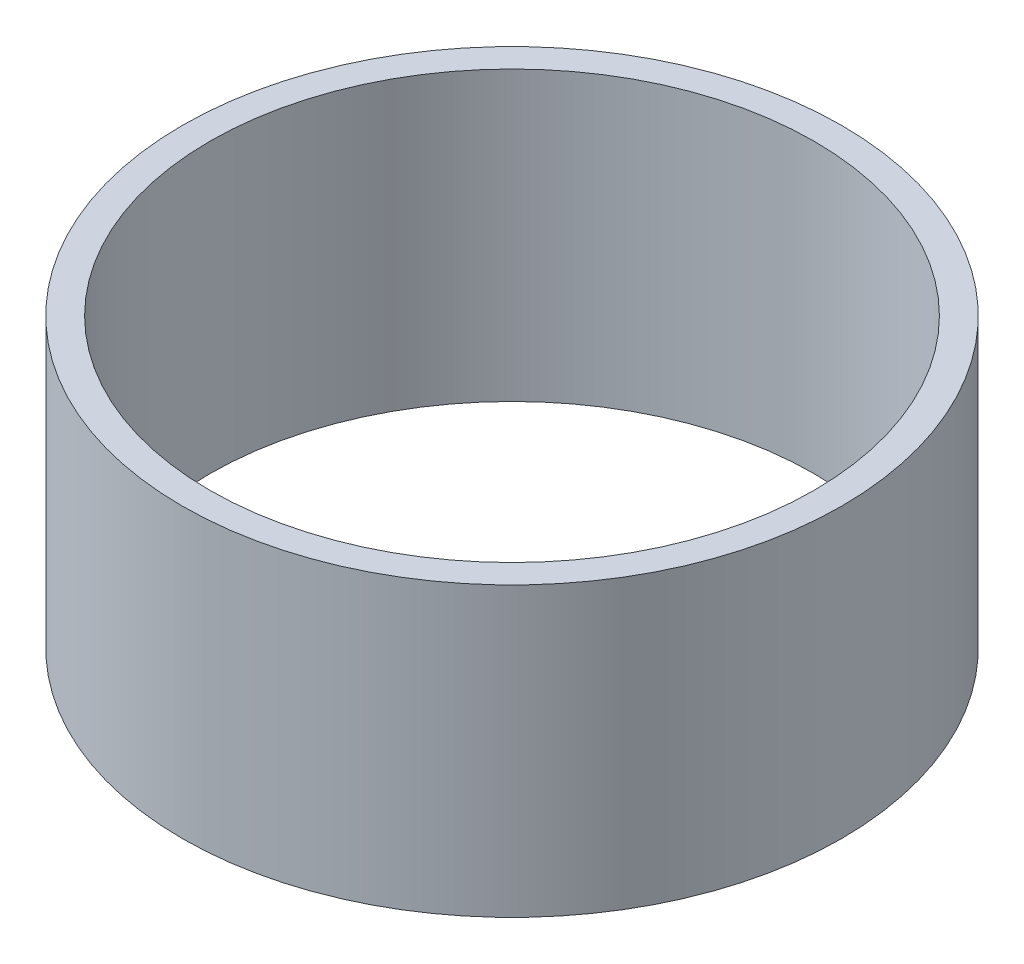
ISO-10303-21;
HEADER;
FILE_DESCRIPTION(('STEP AP214'),'2;1');
FILE_NAME('part.step','',(''),(''),'','','');
FILE_SCHEMA(('AUTOMOTIVE_DESIGN { 1 0 10303 214 1 1 1 1 }'));
ENDSEC;
DATA;
#1=APPLICATION_CONTEXT('core data for automotive mechanical design processes');
#2=APPLICATION_PROTOCOL_DEFINITION('international standard','automotive_design',2000,#1);
#3=PRODUCT_CONTEXT('',#1,'mechanical');
#4=PRODUCT('Part','Part','',(#3));
#5=PRODUCT_RELATED_PRODUCT_CATEGORY('part','',(#4));
#6=PRODUCT_DEFINITION_FORMATION('','',#4);
#7=PRODUCT_DEFINITION_CONTEXT('part definition',#1,'design');
#8=PRODUCT_DEFINITION('design','',#6,#7);
#9=PRODUCT_DEFINITION_SHAPE('','',#8);
#10=(LENGTH_UNIT() NAMED_UNIT(*) SI_UNIT(.MILLI.,.METRE.));
#11=(NAMED_UNIT(*) PLANE_ANGLE_UNIT() SI_UNIT($,.RADIAN.));
#12=(NAMED_UNIT(*) SI_UNIT($,.STERADIAN.) SOLID_ANGLE_UNIT());
#13=UNCERTAINTY_MEASURE_WITH_UNIT(LENGTH_MEASURE(1.E-05),#10,'distance_accuracy_value','');
#14=(GEOMETRIC_REPRESENTATION_CONTEXT(3) GLOBAL_UNCERTAINTY_ASSIGNED_CONTEXT((#13)) GLOBAL_UNIT_ASSIGNED_CONTEXT((#10,
#11,#12)) REPRESENTATION_CONTEXT('',''));
#15=CARTESIAN_POINT('',(0.,0.,0.));
#16=DIRECTION('',(0.,0.,1.));
#17=DIRECTION('',(1.,0.,0.));
#18=AXIS2_PLACEMENT_3D('',#15,#16,#17);
#19=CARTESIAN_POINT('',(0.,33.274,0.));
#20=DIRECTION('',(0.,1.,0.));
#21=DIRECTION('',(0.,0.,1.));
#22=AXIS2_PLACEMENT_3D('',#19,#20,#21);
#23=PLANE('',#22);
#24=CARTESIAN_POINT('',(0.,33.274,0.));
#25=DIRECTION('',(0.,1.,0.));
#26=DIRECTION('',(0.,0.,1.));
#27=AXIS2_PLACEMENT_3D('',#24,#25,#26);
#28=CIRCLE('',#27,76.2);
#29=CARTESIAN_POINT('',(0.,33.274,76.2));
#30=VERTEX_POINT('',#29);
#31=EDGE_CURVE('E10',#30,#30,#28,.T.);
#32=ORIENTED_EDGE('',*,*,#31,.T.);
#33=EDGE_LOOP('',(#32));
#34=FACE_BOUND('',#33,.T.);
#35=CARTESIAN_POINT('',(0.,33.274,0.));
#36=DIRECTION('',(0.,1.,0.));
#37=DIRECTION('',(0.,0.,1.));
#38=AXIS2_PLACEMENT_3D('',#35,#36,#37);
#39=CIRCLE('',#38,69.85);
#40=CARTESIAN_POINT('',(0.,33.274,69.85));
#41=VERTEX_POINT('',#40);
#42=EDGE_CURVE('E42',#41,#41,#39,.T.);
#43=ORIENTED_EDGE('',*,*,#42,.F.);
#44=EDGE_LOOP('',(#43));
#45=FACE_BOUND('',#44,.T.);
#46=ADVANCED_FACE('F31',(#34,#45),#23,.T.);
#47=CARTESIAN_POINT('',(0.,-33.274,0.));
#48=DIRECTION('',(0.,1.,0.));
#49=DIRECTION('',(0.,0.,1.));
#50=AXIS2_PLACEMENT_3D('',#47,#48,#49);
#51=PLANE('',#50);
#52=CARTESIAN_POINT('',(0.,-33.274,0.));
#53=DIRECTION('',(0.,1.,0.));
#54=DIRECTION('',(0.,0.,1.));
#55=AXIS2_PLACEMENT_3D('',#52,#53,#54);
#56=CIRCLE('',#55,76.2);
#57=CARTESIAN_POINT('',(0.,-33.274,76.2));
#58=VERTEX_POINT('',#57);
#59=EDGE_CURVE('E35',#58,#58,#56,.T.);
#60=ORIENTED_EDGE('',*,*,#59,.F.);
#61=EDGE_LOOP('',(#60));
#62=FACE_BOUND('',#61,.T.);
#63=CARTESIAN_POINT('',(0.,-33.274,0.));
#64=DIRECTION('',(0.,1.,0.));
#65=DIRECTION('',(0.,0.,1.));
#66=AXIS2_PLACEMENT_3D('',#63,#64,#65);
#67=CIRCLE('',#66,69.85);
#68=CARTESIAN_POINT('',(0.,-33.274,69.85));
#69=VERTEX_POINT('',#68);
#70=EDGE_CURVE('E44',#69,#69,#67,.T.);
#71=ORIENTED_EDGE('',*,*,#70,.T.);
#72=EDGE_LOOP('',(#71));
#73=FACE_BOUND('',#72,.T.);
#74=ADVANCED_FACE('F54',(#62,#73),#51,.F.);
#75=CARTESIAN_POINT('',(0.,33.274,0.));
#76=DIRECTION('',(0.,-1.,0.));
#77=DIRECTION('',(0.,0.,-1.));
#78=AXIS2_PLACEMENT_3D('',#75,#76,#77);
#79=CYLINDRICAL_SURFACE('',#78,76.2);
#80=ORIENTED_EDGE('',*,*,#31,.F.);
#81=EDGE_LOOP('',(#80));
#82=FACE_BOUND('',#81,.T.);
#83=ORIENTED_EDGE('',*,*,#59,.T.);
#84=EDGE_LOOP('',(#83));
#85=FACE_BOUND('',#84,.T.);
#86=ADVANCED_FACE('F33',(#82,#85),#79,.T.);
#87=CARTESIAN_POINT('',(0.,33.274,0.));
#88=DIRECTION('',(0.,-1.,0.));
#89=DIRECTION('',(0.,0.,-1.));
#90=AXIS2_PLACEMENT_3D('',#87,#88,#89);
#91=CYLINDRICAL_SURFACE('',#90,69.85);
#92=ORIENTED_EDGE('',*,*,#42,.T.);
#93=EDGE_LOOP('',(#92));
#94=FACE_BOUND('',#93,.T.);
#95=ORIENTED_EDGE('',*,*,#70,.F.);
#96=EDGE_LOOP('',(#95));
#97=FACE_BOUND('',#96,.T.);
#98=ADVANCED_FACE('F50',(#94,#97),#91,.F.);
#99=CLOSED_SHELL('',(#46,#74,#86,#98));
#100=MANIFOLD_SOLID_BREP('B2',#99);
#101=ADVANCED_BREP_SHAPE_REPRESENTATION('',(#18,#100),#14);
#102=SHAPE_DEFINITION_REPRESENTATION(#9,#101);
ENDSEC;
END-ISO-10303-21;
